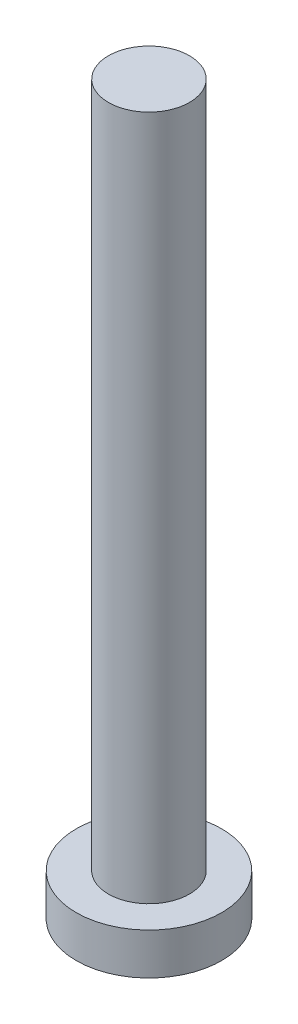
ISO-10303-21;
HEADER;
FILE_DESCRIPTION(('STEP AP214'),'2;1');
FILE_NAME('part.step','',(''),(''),'','','');
FILE_SCHEMA(('AUTOMOTIVE_DESIGN { 1 0 10303 214 1 1 1 1 }'));
ENDSEC;
DATA;
#1=APPLICATION_CONTEXT('core data for automotive mechanical design processes');
#2=APPLICATION_PROTOCOL_DEFINITION('international standard','automotive_design',2000,#1);
#3=PRODUCT_CONTEXT('',#1,'mechanical');
#4=PRODUCT('Part','Part','',(#3));
#5=PRODUCT_RELATED_PRODUCT_CATEGORY('part','',(#4));
#6=PRODUCT_DEFINITION_FORMATION('','',#4);
#7=PRODUCT_DEFINITION_CONTEXT('part definition',#1,'design');
#8=PRODUCT_DEFINITION('design','',#6,#7);
#9=PRODUCT_DEFINITION_SHAPE('','',#8);
#10=(LENGTH_UNIT() NAMED_UNIT(*) SI_UNIT(.MILLI.,.METRE.));
#11=(NAMED_UNIT(*) PLANE_ANGLE_UNIT() SI_UNIT($,.RADIAN.));
#12=(NAMED_UNIT(*) SI_UNIT($,.STERADIAN.) SOLID_ANGLE_UNIT());
#13=UNCERTAINTY_MEASURE_WITH_UNIT(LENGTH_MEASURE(1.E-05),#10,'distance_accuracy_value','');
#14=(GEOMETRIC_REPRESENTATION_CONTEXT(3) GLOBAL_UNCERTAINTY_ASSIGNED_CONTEXT((#13)) GLOBAL_UNIT_ASSIGNED_CONTEXT((#10,
#11,#12)) REPRESENTATION_CONTEXT('',''));
#15=CARTESIAN_POINT('',(0.,0.,0.));
#16=DIRECTION('',(0.,0.,1.));
#17=DIRECTION('',(1.,0.,0.));
#18=AXIS2_PLACEMENT_3D('',#15,#16,#17);
#19=CARTESIAN_POINT('',(0.,0.,0.));
#20=DIRECTION('',(0.,-1.,0.));
#21=DIRECTION('',(0.,0.,-1.));
#22=AXIS2_PLACEMENT_3D('',#19,#20,#21);
#23=CYLINDRICAL_SURFACE('',#22,7.);
#24=CARTESIAN_POINT('',(0.,0.,0.));
#25=DIRECTION('',(0.,1.,0.));
#26=DIRECTION('',(0.,0.,1.));
#27=AXIS2_PLACEMENT_3D('',#24,#25,#26);
#28=CIRCLE('',#27,7.);
#29=CARTESIAN_POINT('',(0.,0.,7.));
#30=VERTEX_POINT('',#29);
#31=EDGE_CURVE('E46',#30,#30,#28,.T.);
#32=ORIENTED_EDGE('',*,*,#31,.F.);
#33=EDGE_LOOP('',(#32));
#34=FACE_BOUND('',#33,.T.);
#35=CARTESIAN_POINT('',(0.,-4.,0.));
#36=DIRECTION('',(0.,1.,0.));
#37=DIRECTION('',(0.,0.,1.));
#38=AXIS2_PLACEMENT_3D('',#35,#36,#37);
#39=CIRCLE('',#38,7.);
#40=CARTESIAN_POINT('',(0.,-4.,7.));
#41=VERTEX_POINT('',#40);
#42=EDGE_CURVE('E45',#41,#41,#39,.T.);
#43=ORIENTED_EDGE('',*,*,#42,.T.);
#44=EDGE_LOOP('',(#43));
#45=FACE_BOUND('',#44,.T.);
#46=ADVANCED_FACE('F39',(#34,#45),#23,.T.);
#47=CARTESIAN_POINT('',(0.,0.,0.));
#48=DIRECTION('',(0.,1.,0.));
#49=DIRECTION('',(0.,0.,1.));
#50=AXIS2_PLACEMENT_3D('',#47,#48,#49);
#51=PLANE('',#50);
#52=CARTESIAN_POINT('',(0.,0.,0.));
#53=DIRECTION('',(0.,1.,0.));
#54=DIRECTION('',(0.,0.,1.));
#55=AXIS2_PLACEMENT_3D('',#52,#53,#54);
#56=CIRCLE('',#55,3.9);
#57=CARTESIAN_POINT('',(0.,0.,3.9));
#58=VERTEX_POINT('',#57);
#59=EDGE_CURVE('E10',#58,#58,#56,.T.);
#60=ORIENTED_EDGE('',*,*,#59,.F.);
#61=EDGE_LOOP('',(#60));
#62=FACE_BOUND('',#61,.T.);
#63=ORIENTED_EDGE('',*,*,#31,.T.);
#64=EDGE_LOOP('',(#63));
#65=FACE_BOUND('',#64,.T.);
#66=ADVANCED_FACE('F65',(#62,#65),#51,.T.);
#67=CARTESIAN_POINT('',(0.,-4.,0.));
#68=DIRECTION('',(0.,1.,0.));
#69=DIRECTION('',(0.,0.,1.));
#70=AXIS2_PLACEMENT_3D('',#67,#68,#69);
#71=PLANE('',#70);
#72=ORIENTED_EDGE('',*,*,#42,.F.);
#73=EDGE_LOOP('',(#72));
#74=FACE_BOUND('',#73,.T.);
#75=ADVANCED_FACE('F58',(#74),#71,.F.);
#76=CARTESIAN_POINT('',(0.,66.,0.));
#77=DIRECTION('',(0.,-1.,0.));
#78=DIRECTION('',(0.,0.,-1.));
#79=AXIS2_PLACEMENT_3D('',#76,#77,#78);
#80=CYLINDRICAL_SURFACE('',#79,3.9);
#81=CARTESIAN_POINT('',(0.,66.,0.));
#82=DIRECTION('',(0.,1.,0.));
#83=DIRECTION('',(0.,0.,1.));
#84=AXIS2_PLACEMENT_3D('',#81,#82,#83);
#85=CIRCLE('',#84,3.9);
#86=CARTESIAN_POINT('',(0.,66.,3.9));
#87=VERTEX_POINT('',#86);
#88=EDGE_CURVE('E55',#87,#87,#85,.T.);
#89=ORIENTED_EDGE('',*,*,#88,.F.);
#90=EDGE_LOOP('',(#89));
#91=FACE_BOUND('',#90,.T.);
#92=ORIENTED_EDGE('',*,*,#59,.T.);
#93=EDGE_LOOP('',(#92));
#94=FACE_BOUND('',#93,.T.);
#95=ADVANCED_FACE('F61',(#91,#94),#80,.T.);
#96=CARTESIAN_POINT('',(0.,66.,0.));
#97=DIRECTION('',(0.,1.,0.));
#98=DIRECTION('',(0.,0.,1.));
#99=AXIS2_PLACEMENT_3D('',#96,#97,#98);
#100=PLANE('',#99);
#101=ORIENTED_EDGE('',*,*,#88,.T.);
#102=EDGE_LOOP('',(#101));
#103=FACE_BOUND('',#102,.T.);
#104=ADVANCED_FACE('F67',(#103),#100,.T.);
#105=CLOSED_SHELL('',(#46,#66,#75,#95,#104));
#106=MANIFOLD_SOLID_BREP('B2',#105);
#107=ADVANCED_BREP_SHAPE_REPRESENTATION('',(#18,#106),#14);
#108=SHAPE_DEFINITION_REPRESENTATION(#9,#107);
ENDSEC;
END-ISO-10303-21;
